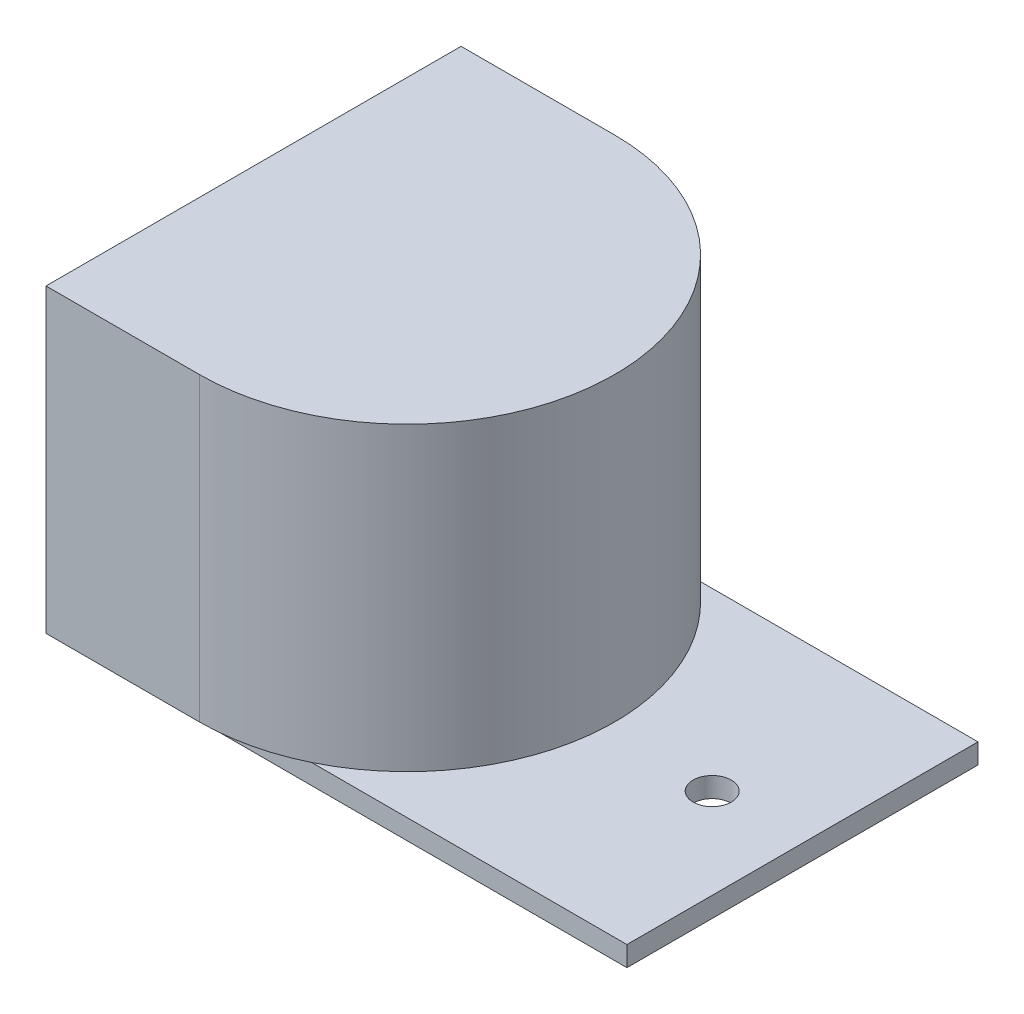
ISO-10303-21;
HEADER;
FILE_DESCRIPTION(('STEP AP214'),'2;1');
FILE_NAME('part.step','',(''),(''),'','','');
FILE_SCHEMA(('AUTOMOTIVE_DESIGN { 1 0 10303 214 1 1 1 1 }'));
ENDSEC;
DATA;
#1=APPLICATION_CONTEXT('core data for automotive mechanical design processes');
#2=APPLICATION_PROTOCOL_DEFINITION('international standard','automotive_design',2000,#1);
#3=PRODUCT_CONTEXT('',#1,'mechanical');
#4=PRODUCT('Part','Part','',(#3));
#5=PRODUCT_RELATED_PRODUCT_CATEGORY('part','',(#4));
#6=PRODUCT_DEFINITION_FORMATION('','',#4);
#7=PRODUCT_DEFINITION_CONTEXT('part definition',#1,'design');
#8=PRODUCT_DEFINITION('design','',#6,#7);
#9=PRODUCT_DEFINITION_SHAPE('','',#8);
#10=(LENGTH_UNIT() NAMED_UNIT(*) SI_UNIT(.MILLI.,.METRE.));
#11=(NAMED_UNIT(*) PLANE_ANGLE_UNIT() SI_UNIT($,.RADIAN.));
#12=(NAMED_UNIT(*) SI_UNIT($,.STERADIAN.) SOLID_ANGLE_UNIT());
#13=UNCERTAINTY_MEASURE_WITH_UNIT(LENGTH_MEASURE(1.E-05),#10,'distance_accuracy_value','');
#14=(GEOMETRIC_REPRESENTATION_CONTEXT(3) GLOBAL_UNCERTAINTY_ASSIGNED_CONTEXT((#13)) GLOBAL_UNIT_ASSIGNED_CONTEXT((#10,
#11,#12)) REPRESENTATION_CONTEXT('',''));
#15=CARTESIAN_POINT('',(0.,0.,0.));
#16=DIRECTION('',(0.,0.,1.));
#17=DIRECTION('',(1.,0.,0.));
#18=AXIS2_PLACEMENT_3D('',#15,#16,#17);
#19=CARTESIAN_POINT('',(-315.136696742491,20.,-10.9343838691914));
#20=DIRECTION('',(0.,1.,0.));
#21=DIRECTION('',(0.,0.,1.));
#22=AXIS2_PLACEMENT_3D('',#19,#20,#21);
#23=PLANE('',#22);
#24=CARTESIAN_POINT('',(-315.136696742491,20.,-10.9343838691914));
#25=DIRECTION('',(0.,1.,0.));
#26=DIRECTION('',(0.,0.,-1.));
#27=AXIS2_PLACEMENT_3D('',#24,#25,#26);
#28=CIRCLE('',#27,206.912187063159);
#29=CARTESIAN_POINT('',(-315.136696742491,20.,195.977803193968));
#30=VERTEX_POINT('',#29);
#31=CARTESIAN_POINT('',(-315.136696742491,20.,-217.846570932351));
#32=VERTEX_POINT('',#31);
#33=EDGE_CURVE('E62',#30,#32,#28,.T.);
#34=ORIENTED_EDGE('',*,*,#33,.T.);
#35=DIRECTION('',(-1.,0.,0.));
#36=VECTOR('',#35,1.);
#37=CARTESIAN_POINT('',(-468.21807091117,20.,-217.846570932351));
#38=LINE('',#37,#36);
#39=CARTESIAN_POINT('',(-468.21807091117,20.,-217.846570932351));
#40=VERTEX_POINT('',#39);
#41=EDGE_CURVE('E73',#32,#40,#38,.T.);
#42=ORIENTED_EDGE('',*,*,#41,.T.);
#43=DIRECTION('',(0.,0.,1.));
#44=VECTOR('',#43,1.);
#45=CARTESIAN_POINT('',(-468.21807091117,20.,195.977803193968));
#46=LINE('',#45,#44);
#47=CARTESIAN_POINT('',(-468.21807091117,20.,195.977803193968));
#48=VERTEX_POINT('',#47);
#49=EDGE_CURVE('E58',#40,#48,#46,.T.);
#50=ORIENTED_EDGE('',*,*,#49,.T.);
#51=DIRECTION('',(1.,0.,0.));
#52=VECTOR('',#51,1.);
#53=CARTESIAN_POINT('',(-315.136696742491,20.,195.977803193968));
#54=LINE('',#53,#52);
#55=EDGE_CURVE('E12',#48,#30,#54,.T.);
#56=ORIENTED_EDGE('',*,*,#55,.T.);
#57=EDGE_LOOP('',(#34,#42,#50,#56));
#58=FACE_BOUND('',#57,.T.);
#59=ADVANCED_FACE('F53',(#58),#23,.T.);
#60=OPEN_SHELL('',(#59));
#61=SHELL_BASED_SURFACE_MODEL('B2',(#60));
#62=CARTESIAN_POINT('',(-315.136696742491,320.,-10.9343838691914));
#63=DIRECTION('',(0.,-1.,0.));
#64=DIRECTION('',(0.,0.,-1.));
#65=AXIS2_PLACEMENT_3D('',#62,#63,#64);
#66=CYLINDRICAL_SURFACE('',#65,206.912187063159);
#67=CARTESIAN_POINT('',(-315.136696742491,20.,-10.9343838691914));
#68=DIRECTION('',(0.,1.,0.));
#69=DIRECTION('',(0.,0.,-1.));
#70=AXIS2_PLACEMENT_3D('',#67,#68,#69);
#71=CIRCLE('',#70,206.912187063159);
#72=CARTESIAN_POINT('',(-315.136696742491,20.,195.977803193968));
#73=VERTEX_POINT('',#72);
#74=CARTESIAN_POINT('',(-315.136696742491,20.,-217.846570932351));
#75=VERTEX_POINT('',#74);
#76=EDGE_CURVE('E166',#73,#75,#71,.T.);
#77=ORIENTED_EDGE('',*,*,#76,.T.);
#78=DIRECTION('',(0.,-1.,0.));
#79=VECTOR('',#78,1.);
#80=CARTESIAN_POINT('',(-315.136696742491,320.,-217.846570932351));
#81=LINE('',#80,#79);
#82=CARTESIAN_POINT('',(-315.136696742491,320.,-217.846570932351));
#83=VERTEX_POINT('',#82);
#84=EDGE_CURVE('E51',#83,#75,#81,.T.);
#85=ORIENTED_EDGE('',*,*,#84,.F.);
#86=CARTESIAN_POINT('',(-315.136696742491,320.,-10.9343838691914));
#87=DIRECTION('',(0.,1.,0.));
#88=DIRECTION('',(0.,0.,-1.));
#89=AXIS2_PLACEMENT_3D('',#86,#87,#88);
#90=CIRCLE('',#89,206.912187063159);
#91=CARTESIAN_POINT('',(-315.136696742491,320.,195.977803193968));
#92=VERTEX_POINT('',#91);
#93=EDGE_CURVE('E159',#92,#83,#90,.T.);
#94=ORIENTED_EDGE('',*,*,#93,.F.);
#95=DIRECTION('',(0.,-1.,0.));
#96=VECTOR('',#95,1.);
#97=CARTESIAN_POINT('',(-315.136696742491,320.,195.977803193968));
#98=LINE('',#97,#96);
#99=EDGE_CURVE('E155',#92,#73,#98,.T.);
#100=ORIENTED_EDGE('',*,*,#99,.T.);
#101=EDGE_LOOP('',(#77,#85,#94,#100));
#102=FACE_BOUND('',#101,.T.);
#103=ADVANCED_FACE('F107',(#102),#66,.T.);
#104=CARTESIAN_POINT('',(-468.21807091117,320.,-217.846570932351));
#105=DIRECTION('',(0.,0.,1.));
#106=DIRECTION('',(1.,0.,0.));
#107=AXIS2_PLACEMENT_3D('',#104,#105,#106);
#108=PLANE('',#107);
#109=DIRECTION('',(-1.,0.,0.));
#110=VECTOR('',#109,1.);
#111=CARTESIAN_POINT('',(-468.21807091117,20.,-217.846570932351));
#112=LINE('',#111,#110);
#113=CARTESIAN_POINT('',(-468.21807091117,20.,-217.846570932351));
#114=VERTEX_POINT('',#113);
#115=EDGE_CURVE('E163',#75,#114,#112,.T.);
#116=ORIENTED_EDGE('',*,*,#115,.T.);
#117=DIRECTION('',(0.,-1.,0.));
#118=VECTOR('',#117,1.);
#119=CARTESIAN_POINT('',(-468.21807091117,320.,-217.846570932351));
#120=LINE('',#119,#118);
#121=CARTESIAN_POINT('',(-468.21807091117,320.,-217.846570932351));
#122=VERTEX_POINT('',#121);
#123=EDGE_CURVE('E109',#122,#114,#120,.T.);
#124=ORIENTED_EDGE('',*,*,#123,.F.);
#125=DIRECTION('',(-1.,0.,0.));
#126=VECTOR('',#125,1.);
#127=CARTESIAN_POINT('',(-468.21807091117,320.,-217.846570932351));
#128=LINE('',#127,#126);
#129=EDGE_CURVE('E149',#83,#122,#128,.T.);
#130=ORIENTED_EDGE('',*,*,#129,.F.);
#131=ORIENTED_EDGE('',*,*,#84,.T.);
#132=EDGE_LOOP('',(#116,#124,#130,#131));
#133=FACE_BOUND('',#132,.T.);
#134=ADVANCED_FACE('F152',(#133),#108,.F.);
#135=CARTESIAN_POINT('',(-468.21807091117,320.,195.977803193968));
#136=DIRECTION('',(1.,0.,0.));
#137=DIRECTION('',(0.,0.,-1.));
#138=AXIS2_PLACEMENT_3D('',#135,#136,#137);
#139=PLANE('',#138);
#140=DIRECTION('',(0.,0.,1.));
#141=VECTOR('',#140,1.);
#142=CARTESIAN_POINT('',(-468.21807091117,20.,195.977803193968));
#143=LINE('',#142,#141);
#144=CARTESIAN_POINT('',(-468.21807091117,20.,195.977803193968));
#145=VERTEX_POINT('',#144);
#146=EDGE_CURVE('E138',#114,#145,#143,.T.);
#147=ORIENTED_EDGE('',*,*,#146,.T.);
#148=DIRECTION('',(0.,-1.,0.));
#149=VECTOR('',#148,1.);
#150=CARTESIAN_POINT('',(-468.21807091117,320.,195.977803193968));
#151=LINE('',#150,#149);
#152=CARTESIAN_POINT('',(-468.21807091117,320.,195.977803193968));
#153=VERTEX_POINT('',#152);
#154=EDGE_CURVE('E176',#153,#145,#151,.T.);
#155=ORIENTED_EDGE('',*,*,#154,.F.);
#156=DIRECTION('',(0.,0.,1.));
#157=VECTOR('',#156,1.);
#158=CARTESIAN_POINT('',(-468.21807091117,320.,195.977803193968));
#159=LINE('',#158,#157);
#160=EDGE_CURVE('E156',#122,#153,#159,.T.);
#161=ORIENTED_EDGE('',*,*,#160,.F.);
#162=ORIENTED_EDGE('',*,*,#123,.T.);
#163=EDGE_LOOP('',(#147,#155,#161,#162));
#164=FACE_BOUND('',#163,.T.);
#165=ADVANCED_FACE('F177',(#164),#139,.F.);
#166=CARTESIAN_POINT('',(-315.136696742491,320.,195.977803193968));
#167=DIRECTION('',(0.,0.,-1.));
#168=DIRECTION('',(-1.,0.,0.));
#169=AXIS2_PLACEMENT_3D('',#166,#167,#168);
#170=PLANE('',#169);
#171=DIRECTION('',(1.,0.,0.));
#172=VECTOR('',#171,1.);
#173=CARTESIAN_POINT('',(-315.136696742491,20.,195.977803193968));
#174=LINE('',#173,#172);
#175=EDGE_CURVE('E144',#145,#73,#174,.T.);
#176=ORIENTED_EDGE('',*,*,#175,.T.);
#177=ORIENTED_EDGE('',*,*,#99,.F.);
#178=DIRECTION('',(1.,0.,0.));
#179=VECTOR('',#178,1.);
#180=CARTESIAN_POINT('',(-315.136696742491,320.,195.977803193968));
#181=LINE('',#180,#179);
#182=EDGE_CURVE('E121',#153,#92,#181,.T.);
#183=ORIENTED_EDGE('',*,*,#182,.F.);
#184=ORIENTED_EDGE('',*,*,#154,.T.);
#185=EDGE_LOOP('',(#176,#177,#183,#184));
#186=FACE_BOUND('',#185,.T.);
#187=ADVANCED_FACE('F189',(#186),#170,.F.);
#188=CARTESIAN_POINT('',(-315.136696742491,320.,-10.9343838691914));
#189=DIRECTION('',(0.,-1.,0.));
#190=DIRECTION('',(0.,0.,-1.));
#191=AXIS2_PLACEMENT_3D('',#188,#189,#190);
#192=PLANE('',#191);
#193=ORIENTED_EDGE('',*,*,#93,.T.);
#194=ORIENTED_EDGE('',*,*,#129,.T.);
#195=ORIENTED_EDGE('',*,*,#160,.T.);
#196=ORIENTED_EDGE('',*,*,#182,.T.);
#197=EDGE_LOOP('',(#193,#194,#195,#196));
#198=FACE_BOUND('',#197,.T.);
#199=ADVANCED_FACE('F160',(#198),#192,.F.);
#200=OPEN_SHELL('',(#103,#134,#165,#187,#199));
#201=SHELL_BASED_SURFACE_MODEL('B6',(#200));
#202=CARTESIAN_POINT('',(0.,20.,0.));
#203=DIRECTION('',(0.,1.,0.));
#204=DIRECTION('',(0.,0.,1.));
#205=AXIS2_PLACEMENT_3D('',#202,#203,#204);
#206=PLANE('',#205);
#207=CARTESIAN_POINT('',(-295.,20.,80.0000000000001));
#208=DIRECTION('',(0.,1.,0.));
#209=DIRECTION('',(0.,0.,1.));
#210=AXIS2_PLACEMENT_3D('',#207,#208,#209);
#211=CIRCLE('',#210,8.99999999999999);
#212=CARTESIAN_POINT('',(-295.,20.,89.0000000000001));
#213=VERTEX_POINT('',#212);
#214=EDGE_CURVE('E354',#213,#213,#211,.T.);
#215=ORIENTED_EDGE('',*,*,#214,.F.);
#216=EDGE_LOOP('',(#215));
#217=FACE_BOUND('',#216,.T.);
#218=CARTESIAN_POINT('',(-295.,20.,-80.));
#219=DIRECTION('',(0.,1.,0.));
#220=DIRECTION('',(0.,0.,1.));
#221=AXIS2_PLACEMENT_3D('',#218,#219,#220);
#222=CIRCLE('',#221,8.99999999999999);
#223=CARTESIAN_POINT('',(-295.,20.,-71.));
#224=VERTEX_POINT('',#223);
#225=EDGE_CURVE('E346',#224,#224,#222,.T.);
#226=ORIENTED_EDGE('',*,*,#225,.F.);
#227=EDGE_LOOP('',(#226));
#228=FACE_BOUND('',#227,.T.);
#229=CARTESIAN_POINT('',(0.,20.,0.));
#230=DIRECTION('',(0.,1.,0.));
#231=DIRECTION('',(0.,0.,1.));
#232=AXIS2_PLACEMENT_3D('',#229,#230,#231);
#233=CIRCLE('',#232,19.05);
#234=CARTESIAN_POINT('',(0.,20.,19.05));
#235=VERTEX_POINT('',#234);
#236=EDGE_CURVE('E326',#235,#235,#233,.T.);
#237=ORIENTED_EDGE('',*,*,#236,.F.);
#238=EDGE_LOOP('',(#237));
#239=FACE_BOUND('',#238,.T.);
#240=DIRECTION('',(0.,0.,1.));
#241=VECTOR('',#240,1.);
#242=CARTESIAN_POINT('',(-420.,20.,175.));
#243=LINE('',#242,#241);
#244=CARTESIAN_POINT('',(-420.,20.,-175.));
#245=VERTEX_POINT('',#244);
#246=CARTESIAN_POINT('',(-420.,20.,175.));
#247=VERTEX_POINT('',#246);
#248=EDGE_CURVE('E284',#245,#247,#243,.T.);
#249=ORIENTED_EDGE('',*,*,#248,.T.);
#250=DIRECTION('',(1.,0.,0.));
#251=VECTOR('',#250,1.);
#252=CARTESIAN_POINT('',(90.0000000000001,20.,175.));
#253=LINE('',#252,#251);
#254=CARTESIAN_POINT('',(90.0000000000001,20.,175.));
#255=VERTEX_POINT('',#254);
#256=EDGE_CURVE('E279',#247,#255,#253,.T.);
#257=ORIENTED_EDGE('',*,*,#256,.T.);
#258=DIRECTION('',(0.,0.,-1.));
#259=VECTOR('',#258,1.);
#260=CARTESIAN_POINT('',(90.0000000000001,20.,175.));
#261=LINE('',#260,#259);
#262=CARTESIAN_POINT('',(90.0000000000001,20.,-175.));
#263=VERTEX_POINT('',#262);
#264=EDGE_CURVE('E282',#255,#263,#261,.T.);
#265=ORIENTED_EDGE('',*,*,#264,.T.);
#266=DIRECTION('',(-1.,0.,0.));
#267=VECTOR('',#266,1.);
#268=CARTESIAN_POINT('',(90.0000000000001,20.,-175.));
#269=LINE('',#268,#267);
#270=EDGE_CURVE('E249',#263,#245,#269,.T.);
#271=ORIENTED_EDGE('',*,*,#270,.T.);
#272=EDGE_LOOP('',(#249,#257,#265,#271));
#273=FACE_BOUND('',#272,.T.);
#274=CARTESIAN_POINT('',(-347.89,20.,-125.98));
#275=DIRECTION('',(0.,1.,0.));
#276=DIRECTION('',(0.,0.,1.));
#277=AXIS2_PLACEMENT_3D('',#274,#275,#276);
#278=CIRCLE('',#277,12.5);
#279=CARTESIAN_POINT('',(-347.89,20.,-113.48));
#280=VERTEX_POINT('',#279);
#281=EDGE_CURVE('E304',#280,#280,#278,.T.);
#282=ORIENTED_EDGE('',*,*,#281,.F.);
#283=EDGE_LOOP('',(#282));
#284=FACE_BOUND('',#283,.T.);
#285=CARTESIAN_POINT('',(-352.,20.,113.99));
#286=DIRECTION('',(0.,1.,0.));
#287=DIRECTION('',(0.,0.,1.));
#288=AXIS2_PLACEMENT_3D('',#285,#286,#287);
#289=CIRCLE('',#288,12.5);
#290=CARTESIAN_POINT('',(-352.,20.,126.49));
#291=VERTEX_POINT('',#290);
#292=EDGE_CURVE('E334',#291,#291,#289,.T.);
#293=ORIENTED_EDGE('',*,*,#292,.F.);
#294=EDGE_LOOP('',(#293));
#295=FACE_BOUND('',#294,.T.);
#296=ADVANCED_FACE('F231',(#217,#228,#239,#273,#284,#295),#206,.T.);
#297=CARTESIAN_POINT('',(0.,0.,0.));
#298=DIRECTION('',(0.,1.,0.));
#299=DIRECTION('',(0.,0.,1.));
#300=AXIS2_PLACEMENT_3D('',#297,#298,#299);
#301=PLANE('',#300);
#302=DIRECTION('',(0.,0.,1.));
#303=VECTOR('',#302,1.);
#304=CARTESIAN_POINT('',(-420.,0.,175.));
#305=LINE('',#304,#303);
#306=CARTESIAN_POINT('',(-420.,0.,-175.));
#307=VERTEX_POINT('',#306);
#308=CARTESIAN_POINT('',(-420.,0.,175.));
#309=VERTEX_POINT('',#308);
#310=EDGE_CURVE('E300',#307,#309,#305,.T.);
#311=ORIENTED_EDGE('',*,*,#310,.F.);
#312=DIRECTION('',(-1.,0.,0.));
#313=VECTOR('',#312,1.);
#314=CARTESIAN_POINT('',(90.0000000000001,0.,-175.));
#315=LINE('',#314,#313);
#316=CARTESIAN_POINT('',(90.0000000000001,0.,-175.));
#317=VERTEX_POINT('',#316);
#318=EDGE_CURVE('E272',#317,#307,#315,.T.);
#319=ORIENTED_EDGE('',*,*,#318,.F.);
#320=DIRECTION('',(0.,0.,-1.));
#321=VECTOR('',#320,1.);
#322=CARTESIAN_POINT('',(90.0000000000001,0.,175.));
#323=LINE('',#322,#321);
#324=CARTESIAN_POINT('',(90.0000000000001,0.,175.));
#325=VERTEX_POINT('',#324);
#326=EDGE_CURVE('E266',#325,#317,#323,.T.);
#327=ORIENTED_EDGE('',*,*,#326,.F.);
#328=DIRECTION('',(1.,0.,0.));
#329=VECTOR('',#328,1.);
#330=CARTESIAN_POINT('',(90.0000000000001,0.,175.));
#331=LINE('',#330,#329);
#332=EDGE_CURVE('E289',#309,#325,#331,.T.);
#333=ORIENTED_EDGE('',*,*,#332,.F.);
#334=EDGE_LOOP('',(#311,#319,#327,#333));
#335=FACE_BOUND('',#334,.T.);
#336=CARTESIAN_POINT('',(-347.89,0.,-125.98));
#337=DIRECTION('',(0.,1.,0.));
#338=DIRECTION('',(0.,0.,1.));
#339=AXIS2_PLACEMENT_3D('',#336,#337,#338);
#340=CIRCLE('',#339,12.5);
#341=CARTESIAN_POINT('',(-347.89,0.,-113.48));
#342=VERTEX_POINT('',#341);
#343=EDGE_CURVE('E322',#342,#342,#340,.T.);
#344=ORIENTED_EDGE('',*,*,#343,.T.);
#345=EDGE_LOOP('',(#344));
#346=FACE_BOUND('',#345,.T.);
#347=CARTESIAN_POINT('',(0.,0.,0.));
#348=DIRECTION('',(0.,1.,0.));
#349=DIRECTION('',(0.,0.,1.));
#350=AXIS2_PLACEMENT_3D('',#347,#348,#349);
#351=CIRCLE('',#350,19.05);
#352=CARTESIAN_POINT('',(0.,0.,19.05));
#353=VERTEX_POINT('',#352);
#354=EDGE_CURVE('E330',#353,#353,#351,.T.);
#355=ORIENTED_EDGE('',*,*,#354,.T.);
#356=EDGE_LOOP('',(#355));
#357=FACE_BOUND('',#356,.T.);
#358=CARTESIAN_POINT('',(-352.,0.,113.99));
#359=DIRECTION('',(0.,1.,0.));
#360=DIRECTION('',(0.,0.,1.));
#361=AXIS2_PLACEMENT_3D('',#358,#359,#360);
#362=CIRCLE('',#361,12.5);
#363=CARTESIAN_POINT('',(-352.,0.,126.49));
#364=VERTEX_POINT('',#363);
#365=EDGE_CURVE('E338',#364,#364,#362,.T.);
#366=ORIENTED_EDGE('',*,*,#365,.T.);
#367=EDGE_LOOP('',(#366));
#368=FACE_BOUND('',#367,.T.);
#369=ADVANCED_FACE('F317',(#335,#346,#357,#368),#301,.F.);
#370=CARTESIAN_POINT('',(-420.,20.,175.));
#371=DIRECTION('',(1.,0.,0.));
#372=DIRECTION('',(0.,0.,-1.));
#373=AXIS2_PLACEMENT_3D('',#370,#371,#372);
#374=PLANE('',#373);
#375=ORIENTED_EDGE('',*,*,#310,.T.);
#376=DIRECTION('',(0.,-1.,0.));
#377=VECTOR('',#376,1.);
#378=CARTESIAN_POINT('',(-420.,20.,175.));
#379=LINE('',#378,#377);
#380=EDGE_CURVE('E105',#247,#309,#379,.T.);
#381=ORIENTED_EDGE('',*,*,#380,.F.);
#382=ORIENTED_EDGE('',*,*,#248,.F.);
#383=DIRECTION('',(0.,-1.,0.));
#384=VECTOR('',#383,1.);
#385=CARTESIAN_POINT('',(-420.,20.,-175.));
#386=LINE('',#385,#384);
#387=EDGE_CURVE('E296',#245,#307,#386,.T.);
#388=ORIENTED_EDGE('',*,*,#387,.T.);
#389=EDGE_LOOP('',(#375,#381,#382,#388));
#390=FACE_BOUND('',#389,.T.);
#391=ADVANCED_FACE('F233',(#390),#374,.F.);
#392=CARTESIAN_POINT('',(90.0000000000001,20.,175.));
#393=DIRECTION('',(0.,0.,-1.));
#394=DIRECTION('',(-1.,0.,0.));
#395=AXIS2_PLACEMENT_3D('',#392,#393,#394);
#396=PLANE('',#395);
#397=ORIENTED_EDGE('',*,*,#332,.T.);
#398=DIRECTION('',(0.,-1.,0.));
#399=VECTOR('',#398,1.);
#400=CARTESIAN_POINT('',(90.0000000000001,20.,175.));
#401=LINE('',#400,#399);
#402=EDGE_CURVE('E241',#255,#325,#401,.T.);
#403=ORIENTED_EDGE('',*,*,#402,.F.);
#404=ORIENTED_EDGE('',*,*,#256,.F.);
#405=ORIENTED_EDGE('',*,*,#380,.T.);
#406=EDGE_LOOP('',(#397,#403,#404,#405));
#407=FACE_BOUND('',#406,.T.);
#408=ADVANCED_FACE('F288',(#407),#396,.F.);
#409=CARTESIAN_POINT('',(90.0000000000001,20.,175.));
#410=DIRECTION('',(-1.,0.,0.));
#411=DIRECTION('',(0.,0.,1.));
#412=AXIS2_PLACEMENT_3D('',#409,#410,#411);
#413=PLANE('',#412);
#414=ORIENTED_EDGE('',*,*,#326,.T.);
#415=DIRECTION('',(0.,-1.,0.));
#416=VECTOR('',#415,1.);
#417=CARTESIAN_POINT('',(90.0000000000001,20.,-175.));
#418=LINE('',#417,#416);
#419=EDGE_CURVE('E291',#263,#317,#418,.T.);
#420=ORIENTED_EDGE('',*,*,#419,.F.);
#421=ORIENTED_EDGE('',*,*,#264,.F.);
#422=ORIENTED_EDGE('',*,*,#402,.T.);
#423=EDGE_LOOP('',(#414,#420,#421,#422));
#424=FACE_BOUND('',#423,.T.);
#425=ADVANCED_FACE('F292',(#424),#413,.F.);
#426=CARTESIAN_POINT('',(90.0000000000001,20.,-175.));
#427=DIRECTION('',(0.,0.,1.));
#428=DIRECTION('',(1.,0.,0.));
#429=AXIS2_PLACEMENT_3D('',#426,#427,#428);
#430=PLANE('',#429);
#431=ORIENTED_EDGE('',*,*,#318,.T.);
#432=ORIENTED_EDGE('',*,*,#387,.F.);
#433=ORIENTED_EDGE('',*,*,#270,.F.);
#434=ORIENTED_EDGE('',*,*,#419,.T.);
#435=EDGE_LOOP('',(#431,#432,#433,#434));
#436=FACE_BOUND('',#435,.T.);
#437=ADVANCED_FACE('F314',(#436),#430,.F.);
#438=CARTESIAN_POINT('',(-347.89,20.,-125.98));
#439=DIRECTION('',(0.,-1.,0.));
#440=DIRECTION('',(0.,0.,-1.));
#441=AXIS2_PLACEMENT_3D('',#438,#439,#440);
#442=CYLINDRICAL_SURFACE('',#441,12.5);
#443=ORIENTED_EDGE('',*,*,#281,.T.);
#444=EDGE_LOOP('',(#443));
#445=FACE_BOUND('',#444,.T.);
#446=ORIENTED_EDGE('',*,*,#343,.F.);
#447=EDGE_LOOP('',(#446));
#448=FACE_BOUND('',#447,.T.);
#449=ADVANCED_FACE('F382',(#445,#448),#442,.F.);
#450=CARTESIAN_POINT('',(0.,20.,0.));
#451=DIRECTION('',(0.,-1.,0.));
#452=DIRECTION('',(0.,0.,-1.));
#453=AXIS2_PLACEMENT_3D('',#450,#451,#452);
#454=CYLINDRICAL_SURFACE('',#453,19.05);
#455=ORIENTED_EDGE('',*,*,#236,.T.);
#456=EDGE_LOOP('',(#455));
#457=FACE_BOUND('',#456,.T.);
#458=ORIENTED_EDGE('',*,*,#354,.F.);
#459=EDGE_LOOP('',(#458));
#460=FACE_BOUND('',#459,.T.);
#461=ADVANCED_FACE('F378',(#457,#460),#454,.F.);
#462=CARTESIAN_POINT('',(-352.,20.,113.99));
#463=DIRECTION('',(0.,-1.,0.));
#464=DIRECTION('',(0.,0.,-1.));
#465=AXIS2_PLACEMENT_3D('',#462,#463,#464);
#466=CYLINDRICAL_SURFACE('',#465,12.5);
#467=ORIENTED_EDGE('',*,*,#292,.T.);
#468=EDGE_LOOP('',(#467));
#469=FACE_BOUND('',#468,.T.);
#470=ORIENTED_EDGE('',*,*,#365,.F.);
#471=EDGE_LOOP('',(#470));
#472=FACE_BOUND('',#471,.T.);
#473=ADVANCED_FACE('F381',(#469,#472),#466,.F.);
#474=CARTESIAN_POINT('',(-295.,285.,-80.));
#475=DIRECTION('',(0.,-1.,0.));
#476=DIRECTION('',(0.,0.,-1.));
#477=AXIS2_PLACEMENT_3D('',#474,#475,#476);
#478=CYLINDRICAL_SURFACE('',#477,8.99999999999999);
#479=CARTESIAN_POINT('',(-295.,285.,-80.));
#480=DIRECTION('',(0.,1.,0.));
#481=DIRECTION('',(0.,0.,1.));
#482=AXIS2_PLACEMENT_3D('',#479,#480,#481);
#483=CIRCLE('',#482,8.99999999999999);
#484=CARTESIAN_POINT('',(-295.,285.,-71.));
#485=VERTEX_POINT('',#484);
#486=EDGE_CURVE('E342',#485,#485,#483,.T.);
#487=ORIENTED_EDGE('',*,*,#486,.F.);
#488=EDGE_LOOP('',(#487));
#489=FACE_BOUND('',#488,.T.);
#490=ORIENTED_EDGE('',*,*,#225,.T.);
#491=EDGE_LOOP('',(#490));
#492=FACE_BOUND('',#491,.T.);
#493=ADVANCED_FACE('F392',(#489,#492),#478,.T.);
#494=CARTESIAN_POINT('',(-295.,285.,-80.));
#495=DIRECTION('',(0.,1.,0.));
#496=DIRECTION('',(0.,0.,1.));
#497=AXIS2_PLACEMENT_3D('',#494,#495,#496);
#498=PLANE('',#497);
#499=ORIENTED_EDGE('',*,*,#486,.T.);
#500=EDGE_LOOP('',(#499));
#501=FACE_BOUND('',#500,.T.);
#502=ADVANCED_FACE('F367',(#501),#498,.T.);
#503=CARTESIAN_POINT('',(-295.,285.,80.0000000000001));
#504=DIRECTION('',(0.,-1.,0.));
#505=DIRECTION('',(0.,0.,-1.));
#506=AXIS2_PLACEMENT_3D('',#503,#504,#505);
#507=CYLINDRICAL_SURFACE('',#506,8.99999999999999);
#508=CARTESIAN_POINT('',(-295.,285.,80.0000000000001));
#509=DIRECTION('',(0.,1.,0.));
#510=DIRECTION('',(0.,0.,1.));
#511=AXIS2_PLACEMENT_3D('',#508,#509,#510);
#512=CIRCLE('',#511,8.99999999999999);
#513=CARTESIAN_POINT('',(-295.,285.,89.0000000000001));
#514=VERTEX_POINT('',#513);
#515=EDGE_CURVE('E350',#514,#514,#512,.T.);
#516=ORIENTED_EDGE('',*,*,#515,.F.);
#517=EDGE_LOOP('',(#516));
#518=FACE_BOUND('',#517,.T.);
#519=ORIENTED_EDGE('',*,*,#214,.T.);
#520=EDGE_LOOP('',(#519));
#521=FACE_BOUND('',#520,.T.);
#522=ADVANCED_FACE('F364',(#518,#521),#507,.T.);
#523=CARTESIAN_POINT('',(-295.,285.,80.0000000000001));
#524=DIRECTION('',(0.,1.,0.));
#525=DIRECTION('',(0.,0.,1.));
#526=AXIS2_PLACEMENT_3D('',#523,#524,#525);
#527=PLANE('',#526);
#528=ORIENTED_EDGE('',*,*,#515,.T.);
#529=EDGE_LOOP('',(#528));
#530=FACE_BOUND('',#529,.T.);
#531=ADVANCED_FACE('F362',(#530),#527,.T.);
#532=CLOSED_SHELL('',(#296,#369,#391,#408,#425,#437,#449,#461,#473,#493,#502,#522,#531));
#533=MANIFOLD_SOLID_BREP('B45',#532);
#534=ADVANCED_BREP_SHAPE_REPRESENTATION('',(#18,#533),#14);
#535=MANIFOLD_SURFACE_SHAPE_REPRESENTATION('',(#18,#61,#201),#14);
#536=SHAPE_REPRESENTATION('',(#18),#14);
#537=SHAPE_DEFINITION_REPRESENTATION(#9,#536);
#538=SHAPE_REPRESENTATION_RELATIONSHIP('','',#536,#534);
#539=SHAPE_REPRESENTATION_RELATIONSHIP('','',#536,#535);
ENDSEC;
END-ISO-10303-21;
